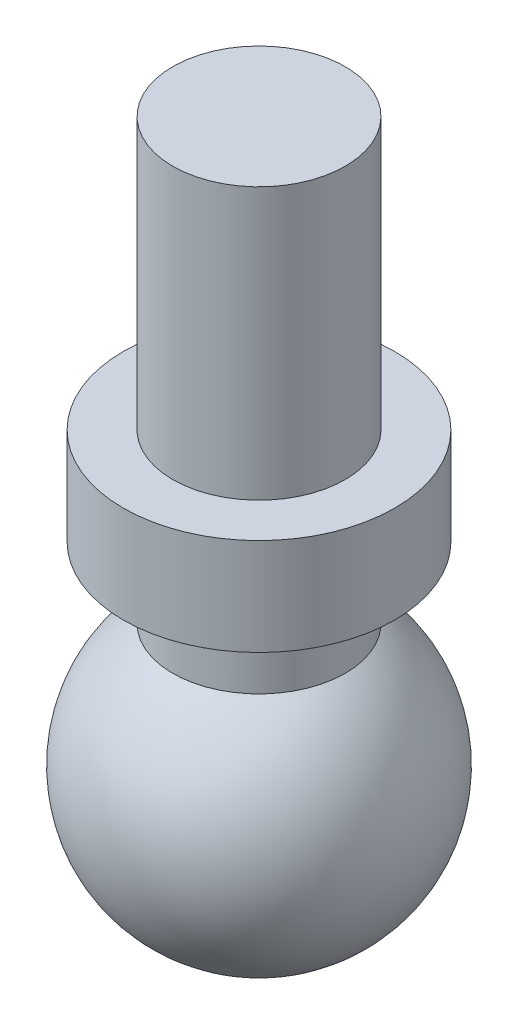
ISO-10303-21;
HEADER;
FILE_DESCRIPTION(('STEP AP214'),'2;1');
FILE_NAME('part.step','',(''),(''),'','','');
FILE_SCHEMA(('AUTOMOTIVE_DESIGN { 1 0 10303 214 1 1 1 1 }'));
ENDSEC;
DATA;
#1=APPLICATION_CONTEXT('core data for automotive mechanical design processes');
#2=APPLICATION_PROTOCOL_DEFINITION('international standard','automotive_design',2000,#1);
#3=PRODUCT_CONTEXT('',#1,'mechanical');
#4=PRODUCT('Part','Part','',(#3));
#5=PRODUCT_RELATED_PRODUCT_CATEGORY('part','',(#4));
#6=PRODUCT_DEFINITION_FORMATION('','',#4);
#7=PRODUCT_DEFINITION_CONTEXT('part definition',#1,'design');
#8=PRODUCT_DEFINITION('design','',#6,#7);
#9=PRODUCT_DEFINITION_SHAPE('','',#8);
#10=(LENGTH_UNIT() NAMED_UNIT(*) SI_UNIT(.MILLI.,.METRE.));
#11=(NAMED_UNIT(*) PLANE_ANGLE_UNIT() SI_UNIT($,.RADIAN.));
#12=(NAMED_UNIT(*) SI_UNIT($,.STERADIAN.) SOLID_ANGLE_UNIT());
#13=UNCERTAINTY_MEASURE_WITH_UNIT(LENGTH_MEASURE(1.E-05),#10,'distance_accuracy_value','');
#14=(GEOMETRIC_REPRESENTATION_CONTEXT(3) GLOBAL_UNCERTAINTY_ASSIGNED_CONTEXT((#13)) GLOBAL_UNIT_ASSIGNED_CONTEXT((#10,
#11,#12)) REPRESENTATION_CONTEXT('',''));
#15=CARTESIAN_POINT('',(0.,0.,0.));
#16=DIRECTION('',(0.,0.,1.));
#17=DIRECTION('',(1.,0.,0.));
#18=AXIS2_PLACEMENT_3D('',#15,#16,#17);
#19=CARTESIAN_POINT('',(0.,7.366,0.));
#20=DIRECTION('',(0.,-1.,0.));
#21=DIRECTION('',(0.,0.,-1.));
#22=AXIS2_PLACEMENT_3D('',#19,#20,#21);
#23=CYLINDRICAL_SURFACE('',#22,1.1303);
#24=CARTESIAN_POINT('',(0.,3.81,0.));
#25=DIRECTION('',(0.,1.,0.));
#26=DIRECTION('',(0.,0.,1.));
#27=AXIS2_PLACEMENT_3D('',#24,#25,#26);
#28=CIRCLE('',#27,1.1303);
#29=CARTESIAN_POINT('',(0.,3.81,1.1303));
#30=VERTEX_POINT('',#29);
#31=EDGE_CURVE('E35',#30,#30,#28,.T.);
#32=ORIENTED_EDGE('',*,*,#31,.T.);
#33=EDGE_LOOP('',(#32));
#34=FACE_BOUND('',#33,.T.);
#35=CARTESIAN_POINT('',(0.,7.366,0.));
#36=DIRECTION('',(0.,1.,0.));
#37=DIRECTION('',(0.,0.,1.));
#38=AXIS2_PLACEMENT_3D('',#35,#36,#37);
#39=CIRCLE('',#38,1.1303);
#40=CARTESIAN_POINT('',(0.,7.366,1.1303));
#41=VERTEX_POINT('',#40);
#42=EDGE_CURVE('E43',#41,#41,#39,.T.);
#43=ORIENTED_EDGE('',*,*,#42,.F.);
#44=EDGE_LOOP('',(#43));
#45=FACE_BOUND('',#44,.T.);
#46=ADVANCED_FACE('F31',(#34,#45),#23,.T.);
#47=CARTESIAN_POINT('',(0.,7.366,0.));
#48=DIRECTION('',(0.,1.,0.));
#49=DIRECTION('',(0.,0.,1.));
#50=AXIS2_PLACEMENT_3D('',#47,#48,#49);
#51=PLANE('',#50);
#52=ORIENTED_EDGE('',*,*,#42,.T.);
#53=EDGE_LOOP('',(#52));
#54=FACE_BOUND('',#53,.T.);
#55=ADVANCED_FACE('F63',(#54),#51,.T.);
#56=CARTESIAN_POINT('',(0.,3.81,0.));
#57=DIRECTION('',(0.,1.,0.));
#58=DIRECTION('',(0.,0.,1.));
#59=AXIS2_PLACEMENT_3D('',#56,#57,#58);
#60=PLANE('',#59);
#61=CARTESIAN_POINT('',(0.,3.81,0.));
#62=DIRECTION('',(0.,1.,0.));
#63=DIRECTION('',(0.,0.,1.));
#64=AXIS2_PLACEMENT_3D('',#61,#62,#63);
#65=CIRCLE('',#64,1.778);
#66=CARTESIAN_POINT('',(0.,3.81,1.778));
#67=VERTEX_POINT('',#66);
#68=EDGE_CURVE('E51',#67,#67,#65,.T.);
#69=ORIENTED_EDGE('',*,*,#68,.T.);
#70=EDGE_LOOP('',(#69));
#71=FACE_BOUND('',#70,.T.);
#72=ORIENTED_EDGE('',*,*,#31,.F.);
#73=EDGE_LOOP('',(#72));
#74=FACE_BOUND('',#73,.T.);
#75=ADVANCED_FACE('F60',(#71,#74),#60,.T.);
#76=CARTESIAN_POINT('',(0.,2.54,0.));
#77=DIRECTION('',(0.,1.,0.));
#78=DIRECTION('',(0.,0.,1.));
#79=AXIS2_PLACEMENT_3D('',#76,#77,#78);
#80=PLANE('',#79);
#81=CARTESIAN_POINT('',(0.,2.54,0.));
#82=DIRECTION('',(0.,1.,0.));
#83=DIRECTION('',(0.,0.,1.));
#84=AXIS2_PLACEMENT_3D('',#81,#82,#83);
#85=CIRCLE('',#84,1.778);
#86=CARTESIAN_POINT('',(0.,2.54,1.778));
#87=VERTEX_POINT('',#86);
#88=EDGE_CURVE('E48',#87,#87,#85,.T.);
#89=ORIENTED_EDGE('',*,*,#88,.F.);
#90=EDGE_LOOP('',(#89));
#91=FACE_BOUND('',#90,.T.);
#92=CARTESIAN_POINT('',(0.,2.54,0.));
#93=DIRECTION('',(0.,1.,0.));
#94=DIRECTION('',(0.,0.,1.));
#95=AXIS2_PLACEMENT_3D('',#92,#93,#94);
#96=CIRCLE('',#95,1.1303);
#97=CARTESIAN_POINT('',(0.,2.54,1.1303));
#98=VERTEX_POINT('',#97);
#99=EDGE_CURVE('E10',#98,#98,#96,.T.);
#100=ORIENTED_EDGE('',*,*,#99,.T.);
#101=EDGE_LOOP('',(#100));
#102=FACE_BOUND('',#101,.T.);
#103=ADVANCED_FACE('F62',(#91,#102),#80,.F.);
#104=CARTESIAN_POINT('',(0.,3.81,0.));
#105=DIRECTION('',(0.,-1.,0.));
#106=DIRECTION('',(0.,0.,-1.));
#107=AXIS2_PLACEMENT_3D('',#104,#105,#106);
#108=CYLINDRICAL_SURFACE('',#107,1.778);
#109=ORIENTED_EDGE('',*,*,#68,.F.);
#110=EDGE_LOOP('',(#109));
#111=FACE_BOUND('',#110,.T.);
#112=ORIENTED_EDGE('',*,*,#88,.T.);
#113=EDGE_LOOP('',(#112));
#114=FACE_BOUND('',#113,.T.);
#115=ADVANCED_FACE('F69',(#111,#114),#108,.T.);
#116=CARTESIAN_POINT('',(0.,0.,0.));
#117=DIRECTION('',(0.,1.,0.));
#118=DIRECTION('',(1.,0.,0.));
#119=AXIS2_PLACEMENT_3D('',#116,#117,#118);
#120=SPHERICAL_SURFACE('',#119,1.9685);
#121=CARTESIAN_POINT('',(0.,1.61164951524827,0.));
#122=DIRECTION('',(0.,-1.,0.));
#123=DIRECTION('',(0.,0.,-1.));
#124=AXIS2_PLACEMENT_3D('',#121,#122,#123);
#125=CIRCLE('',#124,1.1303);
#126=CARTESIAN_POINT('',(0.,1.61164951524827,-1.1303));
#127=VERTEX_POINT('',#126);
#128=EDGE_CURVE('E39',#127,#127,#125,.F.);
#129=ORIENTED_EDGE('',*,*,#128,.F.);
#130=EDGE_LOOP('',(#129));
#131=FACE_BOUND('',#130,.T.);
#132=ADVANCED_FACE('F33',(#131),#120,.T.);
#133=ORIENTED_EDGE('',*,*,#128,.T.);
#134=EDGE_LOOP('',(#133));
#135=FACE_BOUND('',#134,.T.);
#136=ORIENTED_EDGE('',*,*,#99,.F.);
#137=EDGE_LOOP('',(#136));
#138=FACE_BOUND('',#137,.T.);
#139=ADVANCED_FACE('F75',(#135,#138),#23,.T.);
#140=CLOSED_SHELL('',(#46,#55,#75,#103,#115,#132,#139));
#141=MANIFOLD_SOLID_BREP('B2',#140);
#142=ADVANCED_BREP_SHAPE_REPRESENTATION('',(#18,#141),#14);
#143=SHAPE_DEFINITION_REPRESENTATION(#9,#142);
ENDSEC;
END-ISO-10303-21;
